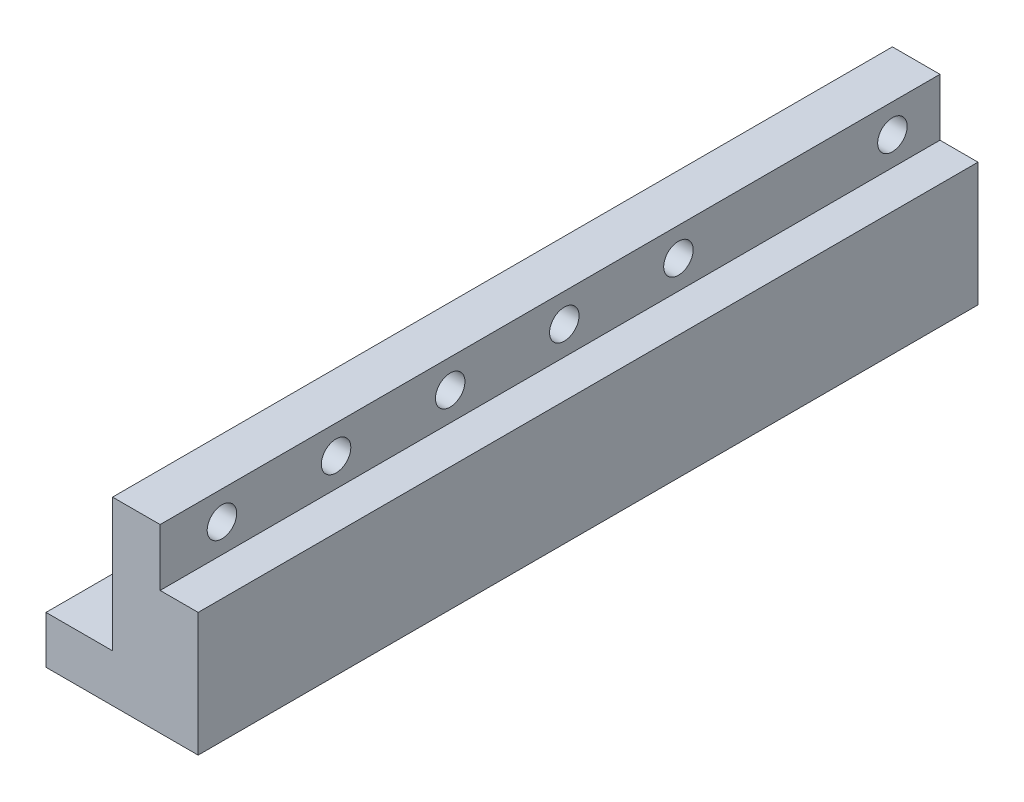
ISO-10303-21;
HEADER;
FILE_DESCRIPTION(('STEP AP214'),'2;1');
FILE_NAME('part.step','',(''),(''),'','','');
FILE_SCHEMA(('AUTOMOTIVE_DESIGN { 1 0 10303 214 1 1 1 1 }'));
ENDSEC;
DATA;
#1=APPLICATION_CONTEXT('core data for automotive mechanical design processes');
#2=APPLICATION_PROTOCOL_DEFINITION('international standard','automotive_design',2000,#1);
#3=PRODUCT_CONTEXT('',#1,'mechanical');
#4=PRODUCT('Part','Part','',(#3));
#5=PRODUCT_RELATED_PRODUCT_CATEGORY('part','',(#4));
#6=PRODUCT_DEFINITION_FORMATION('','',#4);
#7=PRODUCT_DEFINITION_CONTEXT('part definition',#1,'design');
#8=PRODUCT_DEFINITION('design','',#6,#7);
#9=PRODUCT_DEFINITION_SHAPE('','',#8);
#10=(LENGTH_UNIT() NAMED_UNIT(*) SI_UNIT(.MILLI.,.METRE.));
#11=(NAMED_UNIT(*) PLANE_ANGLE_UNIT() SI_UNIT($,.RADIAN.));
#12=(NAMED_UNIT(*) SI_UNIT($,.STERADIAN.) SOLID_ANGLE_UNIT());
#13=UNCERTAINTY_MEASURE_WITH_UNIT(LENGTH_MEASURE(1.E-05),#10,'distance_accuracy_value','');
#14=(GEOMETRIC_REPRESENTATION_CONTEXT(3) GLOBAL_UNCERTAINTY_ASSIGNED_CONTEXT((#13)) GLOBAL_UNIT_ASSIGNED_CONTEXT((#10,
#11,#12)) REPRESENTATION_CONTEXT('',''));
#15=CARTESIAN_POINT('',(0.,0.,0.));
#16=DIRECTION('',(0.,0.,1.));
#17=DIRECTION('',(1.,0.,0.));
#18=AXIS2_PLACEMENT_3D('',#15,#16,#17);
#19=CARTESIAN_POINT('',(-12.5,-13.,71.));
#20=DIRECTION('',(0.,1.,0.));
#21=DIRECTION('',(-1.,0.,0.));
#22=AXIS2_PLACEMENT_3D('',#19,#20,#21);
#23=CYLINDRICAL_SURFACE('',#22,1.55);
#24=CARTESIAN_POINT('',(-12.5,-13.,71.));
#25=DIRECTION('',(0.,1.,0.));
#26=DIRECTION('',(-1.,0.,0.));
#27=AXIS2_PLACEMENT_3D('',#24,#25,#26);
#28=CIRCLE('',#27,1.55);
#29=CARTESIAN_POINT('',(-14.05,-13.,71.));
#30=VERTEX_POINT('',#29);
#31=EDGE_CURVE('E44',#30,#30,#28,.T.);
#32=ORIENTED_EDGE('',*,*,#31,.F.);
#33=EDGE_LOOP('',(#32));
#34=FACE_BOUND('',#33,.T.);
#35=CARTESIAN_POINT('',(-12.5,-8.,71.));
#36=DIRECTION('',(0.,1.,0.));
#37=DIRECTION('',(-1.,0.,0.));
#38=AXIS2_PLACEMENT_3D('',#35,#36,#37);
#39=CIRCLE('',#38,1.55);
#40=CARTESIAN_POINT('',(-14.05,-8.,71.));
#41=VERTEX_POINT('',#40);
#42=EDGE_CURVE('E11',#41,#41,#39,.T.);
#43=ORIENTED_EDGE('',*,*,#42,.T.);
#44=EDGE_LOOP('',(#43));
#45=FACE_BOUND('',#44,.T.);
#46=ADVANCED_FACE('F36',(#34,#45),#23,.F.);
#47=CARTESIAN_POINT('',(-12.5,-13.,56.));
#48=DIRECTION('',(0.,1.,0.));
#49=DIRECTION('',(-1.,0.,0.));
#50=AXIS2_PLACEMENT_3D('',#47,#48,#49);
#51=CYLINDRICAL_SURFACE('',#50,1.55);
#52=CARTESIAN_POINT('',(-12.5,-13.,56.));
#53=DIRECTION('',(0.,1.,0.));
#54=DIRECTION('',(-1.,0.,0.));
#55=AXIS2_PLACEMENT_3D('',#52,#53,#54);
#56=CIRCLE('',#55,1.55);
#57=CARTESIAN_POINT('',(-14.05,-13.,56.));
#58=VERTEX_POINT('',#57);
#59=EDGE_CURVE('E169',#58,#58,#56,.T.);
#60=ORIENTED_EDGE('',*,*,#59,.F.);
#61=EDGE_LOOP('',(#60));
#62=FACE_BOUND('',#61,.T.);
#63=CARTESIAN_POINT('',(-12.5,-8.,56.));
#64=DIRECTION('',(0.,1.,0.));
#65=DIRECTION('',(-1.,0.,0.));
#66=AXIS2_PLACEMENT_3D('',#63,#64,#65);
#67=CIRCLE('',#66,1.55);
#68=CARTESIAN_POINT('',(-14.05,-8.,56.));
#69=VERTEX_POINT('',#68);
#70=EDGE_CURVE('E172',#69,#69,#67,.T.);
#71=ORIENTED_EDGE('',*,*,#70,.T.);
#72=EDGE_LOOP('',(#71));
#73=FACE_BOUND('',#72,.T.);
#74=ADVANCED_FACE('F181',(#62,#73),#51,.F.);
#75=CARTESIAN_POINT('',(-12.5,-13.,41.));
#76=DIRECTION('',(0.,1.,0.));
#77=DIRECTION('',(-1.,0.,0.));
#78=AXIS2_PLACEMENT_3D('',#75,#76,#77);
#79=CYLINDRICAL_SURFACE('',#78,1.55);
#80=CARTESIAN_POINT('',(-12.5,-13.,41.));
#81=DIRECTION('',(0.,1.,0.));
#82=DIRECTION('',(-1.,0.,0.));
#83=AXIS2_PLACEMENT_3D('',#80,#81,#82);
#84=CIRCLE('',#83,1.55);
#85=CARTESIAN_POINT('',(-14.05,-13.,41.));
#86=VERTEX_POINT('',#85);
#87=EDGE_CURVE('E163',#86,#86,#84,.T.);
#88=ORIENTED_EDGE('',*,*,#87,.F.);
#89=EDGE_LOOP('',(#88));
#90=FACE_BOUND('',#89,.T.);
#91=CARTESIAN_POINT('',(-12.5,-8.,41.));
#92=DIRECTION('',(0.,1.,0.));
#93=DIRECTION('',(-1.,0.,0.));
#94=AXIS2_PLACEMENT_3D('',#91,#92,#93);
#95=CIRCLE('',#94,1.55);
#96=CARTESIAN_POINT('',(-14.05,-8.,41.));
#97=VERTEX_POINT('',#96);
#98=EDGE_CURVE('E166',#97,#97,#95,.T.);
#99=ORIENTED_EDGE('',*,*,#98,.T.);
#100=EDGE_LOOP('',(#99));
#101=FACE_BOUND('',#100,.T.);
#102=ADVANCED_FACE('F205',(#90,#101),#79,.F.);
#103=CARTESIAN_POINT('',(-4.,6.,82.));
#104=DIRECTION('',(0.,-1.,0.));
#105=DIRECTION('',(1.,0.,0.));
#106=AXIS2_PLACEMENT_3D('',#103,#104,#105);
#107=PLANE('',#106);
#108=DIRECTION('',(-1.,0.,0.));
#109=VECTOR('',#108,1.);
#110=CARTESIAN_POINT('',(-4.,6.,0.));
#111=LINE('',#110,#109);
#112=CARTESIAN_POINT('',(-4.,6.,0.));
#113=VERTEX_POINT('',#112);
#114=CARTESIAN_POINT('',(-9.,6.,0.));
#115=VERTEX_POINT('',#114);
#116=EDGE_CURVE('E133',#113,#115,#111,.T.);
#117=ORIENTED_EDGE('',*,*,#116,.T.);
#118=DIRECTION('',(0.,0.,-1.));
#119=VECTOR('',#118,1.);
#120=CARTESIAN_POINT('',(-9.,6.,82.));
#121=LINE('',#120,#119);
#122=CARTESIAN_POINT('',(-9.,6.,82.));
#123=VERTEX_POINT('',#122);
#124=EDGE_CURVE('E161',#123,#115,#121,.T.);
#125=ORIENTED_EDGE('',*,*,#124,.F.);
#126=DIRECTION('',(-1.,0.,0.));
#127=VECTOR('',#126,1.);
#128=CARTESIAN_POINT('',(-4.,6.,82.));
#129=LINE('',#128,#127);
#130=CARTESIAN_POINT('',(-4.,6.,82.));
#131=VERTEX_POINT('',#130);
#132=EDGE_CURVE('E148',#131,#123,#129,.T.);
#133=ORIENTED_EDGE('',*,*,#132,.F.);
#134=DIRECTION('',(0.,0.,-1.));
#135=VECTOR('',#134,1.);
#136=CARTESIAN_POINT('',(-4.,6.,82.));
#137=LINE('',#136,#135);
#138=EDGE_CURVE('E129',#131,#113,#137,.T.);
#139=ORIENTED_EDGE('',*,*,#138,.T.);
#140=EDGE_LOOP('',(#117,#125,#133,#139));
#141=FACE_BOUND('',#140,.T.);
#142=ADVANCED_FACE('F196',(#141),#107,.F.);
#143=CARTESIAN_POINT('',(-9.,6.,82.));
#144=DIRECTION('',(1.,0.,0.));
#145=DIRECTION('',(0.,1.,0.));
#146=AXIS2_PLACEMENT_3D('',#143,#144,#145);
#147=PLANE('',#146);
#148=CARTESIAN_POINT('',(-9.,3.,75.5));
#149=DIRECTION('',(1.,0.,0.));
#150=DIRECTION('',(0.,1.,0.));
#151=AXIS2_PLACEMENT_3D('',#148,#149,#150);
#152=CIRCLE('',#151,1.54999999999999);
#153=CARTESIAN_POINT('',(-9.,4.54999999999999,75.5));
#154=VERTEX_POINT('',#153);
#155=EDGE_CURVE('E137',#154,#154,#152,.T.);
#156=ORIENTED_EDGE('',*,*,#155,.T.);
#157=EDGE_LOOP('',(#156));
#158=FACE_BOUND('',#157,.T.);
#159=CARTESIAN_POINT('',(-9.,3.,63.5));
#160=DIRECTION('',(1.,0.,0.));
#161=DIRECTION('',(0.,1.,0.));
#162=AXIS2_PLACEMENT_3D('',#159,#160,#161);
#163=CIRCLE('',#162,1.54999999999999);
#164=CARTESIAN_POINT('',(-9.,4.54999999999999,63.5));
#165=VERTEX_POINT('',#164);
#166=EDGE_CURVE('E316',#165,#165,#163,.T.);
#167=ORIENTED_EDGE('',*,*,#166,.T.);
#168=EDGE_LOOP('',(#167));
#169=FACE_BOUND('',#168,.T.);
#170=CARTESIAN_POINT('',(-9.,3.,51.5));
#171=DIRECTION('',(1.,0.,0.));
#172=DIRECTION('',(0.,1.,0.));
#173=AXIS2_PLACEMENT_3D('',#170,#171,#172);
#174=CIRCLE('',#173,1.55);
#175=CARTESIAN_POINT('',(-9.,4.55,51.5));
#176=VERTEX_POINT('',#175);
#177=EDGE_CURVE('E313',#176,#176,#174,.T.);
#178=ORIENTED_EDGE('',*,*,#177,.T.);
#179=EDGE_LOOP('',(#178));
#180=FACE_BOUND('',#179,.T.);
#181=CARTESIAN_POINT('',(-9.,3.,39.5));
#182=DIRECTION('',(1.,0.,0.));
#183=DIRECTION('',(0.,1.,0.));
#184=AXIS2_PLACEMENT_3D('',#181,#182,#183);
#185=CIRCLE('',#184,1.55);
#186=CARTESIAN_POINT('',(-9.,4.55,39.5));
#187=VERTEX_POINT('',#186);
#188=EDGE_CURVE('E310',#187,#187,#185,.T.);
#189=ORIENTED_EDGE('',*,*,#188,.T.);
#190=EDGE_LOOP('',(#189));
#191=FACE_BOUND('',#190,.T.);
#192=CARTESIAN_POINT('',(-9.,3.,27.5));
#193=DIRECTION('',(1.,0.,0.));
#194=DIRECTION('',(0.,1.,0.));
#195=AXIS2_PLACEMENT_3D('',#192,#193,#194);
#196=CIRCLE('',#195,1.55);
#197=CARTESIAN_POINT('',(-9.,4.55,27.5));
#198=VERTEX_POINT('',#197);
#199=EDGE_CURVE('E307',#198,#198,#196,.T.);
#200=ORIENTED_EDGE('',*,*,#199,.T.);
#201=EDGE_LOOP('',(#200));
#202=FACE_BOUND('',#201,.T.);
#203=CARTESIAN_POINT('',(-9.,3.,5.));
#204=DIRECTION('',(1.,0.,0.));
#205=DIRECTION('',(0.,1.,0.));
#206=AXIS2_PLACEMENT_3D('',#203,#204,#205);
#207=CIRCLE('',#206,1.55);
#208=CARTESIAN_POINT('',(-9.,4.55,5.));
#209=VERTEX_POINT('',#208);
#210=EDGE_CURVE('E290',#209,#209,#207,.T.);
#211=ORIENTED_EDGE('',*,*,#210,.T.);
#212=EDGE_LOOP('',(#211));
#213=FACE_BOUND('',#212,.T.);
#214=DIRECTION('',(0.,-1.,0.));
#215=VECTOR('',#214,1.);
#216=CARTESIAN_POINT('',(-9.,6.,0.));
#217=LINE('',#216,#215);
#218=CARTESIAN_POINT('',(-9.,-8.,0.));
#219=VERTEX_POINT('',#218);
#220=EDGE_CURVE('E136',#115,#219,#217,.T.);
#221=ORIENTED_EDGE('',*,*,#220,.T.);
#222=DIRECTION('',(0.,0.,-1.));
#223=VECTOR('',#222,1.);
#224=CARTESIAN_POINT('',(-9.,-8.,82.));
#225=LINE('',#224,#223);
#226=CARTESIAN_POINT('',(-9.,-8.,82.));
#227=VERTEX_POINT('',#226);
#228=EDGE_CURVE('E158',#227,#219,#225,.T.);
#229=ORIENTED_EDGE('',*,*,#228,.F.);
#230=DIRECTION('',(0.,-1.,0.));
#231=VECTOR('',#230,1.);
#232=CARTESIAN_POINT('',(-9.,6.,82.));
#233=LINE('',#232,#231);
#234=EDGE_CURVE('E96',#123,#227,#233,.T.);
#235=ORIENTED_EDGE('',*,*,#234,.F.);
#236=ORIENTED_EDGE('',*,*,#124,.T.);
#237=EDGE_LOOP('',(#221,#229,#235,#236));
#238=FACE_BOUND('',#237,.T.);
#239=ADVANCED_FACE('F187',(#158,#169,#180,#191,#202,#213,#238),#147,.F.);
#240=CARTESIAN_POINT('',(-9.,-8.,82.));
#241=DIRECTION('',(0.,-1.,0.));
#242=DIRECTION('',(0.,0.,-1.));
#243=AXIS2_PLACEMENT_3D('',#240,#241,#242);
#244=PLANE('',#243);
#245=CARTESIAN_POINT('',(-12.5,-8.,26.));
#246=DIRECTION('',(0.,1.,0.));
#247=DIRECTION('',(-1.,0.,0.));
#248=AXIS2_PLACEMENT_3D('',#245,#246,#247);
#249=CIRCLE('',#248,1.55);
#250=CARTESIAN_POINT('',(-14.05,-8.,26.));
#251=VERTEX_POINT('',#250);
#252=EDGE_CURVE('E276',#251,#251,#249,.T.);
#253=ORIENTED_EDGE('',*,*,#252,.F.);
#254=EDGE_LOOP('',(#253));
#255=FACE_BOUND('',#254,.T.);
#256=CARTESIAN_POINT('',(-12.5,-8.,11.));
#257=DIRECTION('',(0.,1.,0.));
#258=DIRECTION('',(-1.,0.,0.));
#259=AXIS2_PLACEMENT_3D('',#256,#257,#258);
#260=CIRCLE('',#259,1.55);
#261=CARTESIAN_POINT('',(-14.05,-8.,11.));
#262=VERTEX_POINT('',#261);
#263=EDGE_CURVE('E277',#262,#262,#260,.T.);
#264=ORIENTED_EDGE('',*,*,#263,.F.);
#265=EDGE_LOOP('',(#264));
#266=FACE_BOUND('',#265,.T.);
#267=DIRECTION('',(-1.,0.,0.));
#268=VECTOR('',#267,1.);
#269=CARTESIAN_POINT('',(-9.,-8.,0.));
#270=LINE('',#269,#268);
#271=CARTESIAN_POINT('',(-16.,-8.,0.));
#272=VERTEX_POINT('',#271);
#273=EDGE_CURVE('E139',#219,#272,#270,.T.);
#274=ORIENTED_EDGE('',*,*,#273,.T.);
#275=DIRECTION('',(0.,0.,-1.));
#276=VECTOR('',#275,1.);
#277=CARTESIAN_POINT('',(-16.,-8.,82.));
#278=LINE('',#277,#276);
#279=CARTESIAN_POINT('',(-16.,-8.,82.));
#280=VERTEX_POINT('',#279);
#281=EDGE_CURVE('E155',#280,#272,#278,.T.);
#282=ORIENTED_EDGE('',*,*,#281,.F.);
#283=DIRECTION('',(-1.,0.,0.));
#284=VECTOR('',#283,1.);
#285=CARTESIAN_POINT('',(-9.,-8.,82.));
#286=LINE('',#285,#284);
#287=EDGE_CURVE('E323',#227,#280,#286,.T.);
#288=ORIENTED_EDGE('',*,*,#287,.F.);
#289=ORIENTED_EDGE('',*,*,#228,.T.);
#290=EDGE_LOOP('',(#274,#282,#288,#289));
#291=FACE_BOUND('',#290,.T.);
#292=ORIENTED_EDGE('',*,*,#98,.F.);
#293=EDGE_LOOP('',(#292));
#294=FACE_BOUND('',#293,.T.);
#295=ORIENTED_EDGE('',*,*,#70,.F.);
#296=EDGE_LOOP('',(#295));
#297=FACE_BOUND('',#296,.T.);
#298=ORIENTED_EDGE('',*,*,#42,.F.);
#299=EDGE_LOOP('',(#298));
#300=FACE_BOUND('',#299,.T.);
#301=ADVANCED_FACE('F184',(#255,#266,#291,#294,#297,#300),#244,.F.);
#302=CARTESIAN_POINT('',(-16.,-8.,82.));
#303=DIRECTION('',(1.,0.,0.));
#304=DIRECTION('',(0.,0.,-1.));
#305=AXIS2_PLACEMENT_3D('',#302,#303,#304);
#306=PLANE('',#305);
#307=DIRECTION('',(0.,-1.,0.));
#308=VECTOR('',#307,1.);
#309=CARTESIAN_POINT('',(-16.,-8.,0.));
#310=LINE('',#309,#308);
#311=CARTESIAN_POINT('',(-16.,-13.,0.));
#312=VERTEX_POINT('',#311);
#313=EDGE_CURVE('E141',#272,#312,#310,.T.);
#314=ORIENTED_EDGE('',*,*,#313,.T.);
#315=DIRECTION('',(0.,0.,-1.));
#316=VECTOR('',#315,1.);
#317=CARTESIAN_POINT('',(-16.,-13.,82.));
#318=LINE('',#317,#316);
#319=CARTESIAN_POINT('',(-16.,-13.,82.));
#320=VERTEX_POINT('',#319);
#321=EDGE_CURVE('E152',#320,#312,#318,.T.);
#322=ORIENTED_EDGE('',*,*,#321,.F.);
#323=DIRECTION('',(0.,-1.,0.));
#324=VECTOR('',#323,1.);
#325=CARTESIAN_POINT('',(-16.,-8.,82.));
#326=LINE('',#325,#324);
#327=EDGE_CURVE('E325',#280,#320,#326,.T.);
#328=ORIENTED_EDGE('',*,*,#327,.F.);
#329=ORIENTED_EDGE('',*,*,#281,.T.);
#330=EDGE_LOOP('',(#314,#322,#328,#329));
#331=FACE_BOUND('',#330,.T.);
#332=ADVANCED_FACE('F186',(#331),#306,.F.);
#333=CARTESIAN_POINT('',(-16.,-13.,82.));
#334=DIRECTION('',(0.,1.,0.));
#335=DIRECTION('',(0.,0.,1.));
#336=AXIS2_PLACEMENT_3D('',#333,#334,#335);
#337=PLANE('',#336);
#338=CARTESIAN_POINT('',(-12.5,-13.,26.));
#339=DIRECTION('',(0.,1.,0.));
#340=DIRECTION('',(-1.,0.,0.));
#341=AXIS2_PLACEMENT_3D('',#338,#339,#340);
#342=CIRCLE('',#341,1.55);
#343=CARTESIAN_POINT('',(-14.05,-13.,26.));
#344=VERTEX_POINT('',#343);
#345=EDGE_CURVE('E274',#344,#344,#342,.T.);
#346=ORIENTED_EDGE('',*,*,#345,.T.);
#347=EDGE_LOOP('',(#346));
#348=FACE_BOUND('',#347,.T.);
#349=CARTESIAN_POINT('',(-12.5,-13.,11.));
#350=DIRECTION('',(0.,1.,0.));
#351=DIRECTION('',(-1.,0.,0.));
#352=AXIS2_PLACEMENT_3D('',#349,#350,#351);
#353=CIRCLE('',#352,1.55);
#354=CARTESIAN_POINT('',(-14.05,-13.,11.));
#355=VERTEX_POINT('',#354);
#356=EDGE_CURVE('E280',#355,#355,#353,.T.);
#357=ORIENTED_EDGE('',*,*,#356,.T.);
#358=EDGE_LOOP('',(#357));
#359=FACE_BOUND('',#358,.T.);
#360=DIRECTION('',(1.,0.,0.));
#361=VECTOR('',#360,1.);
#362=CARTESIAN_POINT('',(-16.,-13.,0.));
#363=LINE('',#362,#361);
#364=CARTESIAN_POINT('',(0.,-13.,0.));
#365=VERTEX_POINT('',#364);
#366=EDGE_CURVE('E143',#312,#365,#363,.T.);
#367=ORIENTED_EDGE('',*,*,#366,.T.);
#368=DIRECTION('',(0.,0.,-1.));
#369=VECTOR('',#368,1.);
#370=CARTESIAN_POINT('',(0.,-13.,82.));
#371=LINE('',#370,#369);
#372=CARTESIAN_POINT('',(0.,-13.,82.));
#373=VERTEX_POINT('',#372);
#374=EDGE_CURVE('E124',#373,#365,#371,.T.);
#375=ORIENTED_EDGE('',*,*,#374,.F.);
#376=DIRECTION('',(1.,0.,0.));
#377=VECTOR('',#376,1.);
#378=CARTESIAN_POINT('',(-16.,-13.,82.));
#379=LINE('',#378,#377);
#380=EDGE_CURVE('E115',#320,#373,#379,.T.);
#381=ORIENTED_EDGE('',*,*,#380,.F.);
#382=ORIENTED_EDGE('',*,*,#321,.T.);
#383=EDGE_LOOP('',(#367,#375,#381,#382));
#384=FACE_BOUND('',#383,.T.);
#385=ORIENTED_EDGE('',*,*,#87,.T.);
#386=EDGE_LOOP('',(#385));
#387=FACE_BOUND('',#386,.T.);
#388=ORIENTED_EDGE('',*,*,#59,.T.);
#389=EDGE_LOOP('',(#388));
#390=FACE_BOUND('',#389,.T.);
#391=ORIENTED_EDGE('',*,*,#31,.T.);
#392=EDGE_LOOP('',(#391));
#393=FACE_BOUND('',#392,.T.);
#394=ADVANCED_FACE('F177',(#348,#359,#384,#387,#390,#393),#337,.F.);
#395=CARTESIAN_POINT('',(0.,-13.,82.));
#396=DIRECTION('',(-1.,0.,0.));
#397=DIRECTION('',(0.,0.,1.));
#398=AXIS2_PLACEMENT_3D('',#395,#396,#397);
#399=PLANE('',#398);
#400=DIRECTION('',(0.,1.,0.));
#401=VECTOR('',#400,1.);
#402=CARTESIAN_POINT('',(0.,-13.,0.));
#403=LINE('',#402,#401);
#404=CARTESIAN_POINT('',(0.,0.,0.));
#405=VERTEX_POINT('',#404);
#406=EDGE_CURVE('E123',#365,#405,#403,.T.);
#407=ORIENTED_EDGE('',*,*,#406,.T.);
#408=DIRECTION('',(0.,0.,-1.));
#409=VECTOR('',#408,1.);
#410=CARTESIAN_POINT('',(0.,0.,82.));
#411=LINE('',#410,#409);
#412=CARTESIAN_POINT('',(0.,0.,82.));
#413=VERTEX_POINT('',#412);
#414=EDGE_CURVE('E120',#413,#405,#411,.T.);
#415=ORIENTED_EDGE('',*,*,#414,.F.);
#416=DIRECTION('',(0.,1.,0.));
#417=VECTOR('',#416,1.);
#418=CARTESIAN_POINT('',(0.,-13.,82.));
#419=LINE('',#418,#417);
#420=EDGE_CURVE('E109',#373,#413,#419,.T.);
#421=ORIENTED_EDGE('',*,*,#420,.F.);
#422=ORIENTED_EDGE('',*,*,#374,.T.);
#423=EDGE_LOOP('',(#407,#415,#421,#422));
#424=FACE_BOUND('',#423,.T.);
#425=ADVANCED_FACE('F121',(#424),#399,.F.);
#426=CARTESIAN_POINT('',(0.,0.,82.));
#427=DIRECTION('',(0.,-1.,0.));
#428=DIRECTION('',(1.,0.,0.));
#429=AXIS2_PLACEMENT_3D('',#426,#427,#428);
#430=PLANE('',#429);
#431=DIRECTION('',(-1.,0.,0.));
#432=VECTOR('',#431,1.);
#433=CARTESIAN_POINT('',(0.,0.,0.));
#434=LINE('',#433,#432);
#435=CARTESIAN_POINT('',(-4.,0.,0.));
#436=VERTEX_POINT('',#435);
#437=EDGE_CURVE('E81',#405,#436,#434,.T.);
#438=ORIENTED_EDGE('',*,*,#437,.T.);
#439=DIRECTION('',(0.,0.,-1.));
#440=VECTOR('',#439,1.);
#441=CARTESIAN_POINT('',(-4.,0.,82.));
#442=LINE('',#441,#440);
#443=CARTESIAN_POINT('',(-4.,0.,82.));
#444=VERTEX_POINT('',#443);
#445=EDGE_CURVE('E125',#444,#436,#442,.T.);
#446=ORIENTED_EDGE('',*,*,#445,.F.);
#447=DIRECTION('',(-1.,0.,0.));
#448=VECTOR('',#447,1.);
#449=CARTESIAN_POINT('',(0.,0.,82.));
#450=LINE('',#449,#448);
#451=EDGE_CURVE('E113',#413,#444,#450,.T.);
#452=ORIENTED_EDGE('',*,*,#451,.F.);
#453=ORIENTED_EDGE('',*,*,#414,.T.);
#454=EDGE_LOOP('',(#438,#446,#452,#453));
#455=FACE_BOUND('',#454,.T.);
#456=ADVANCED_FACE('F127',(#455),#430,.F.);
#457=CARTESIAN_POINT('',(-4.,0.,82.));
#458=DIRECTION('',(-1.,0.,0.));
#459=DIRECTION('',(0.,0.,1.));
#460=AXIS2_PLACEMENT_3D('',#457,#458,#459);
#461=PLANE('',#460);
#462=CARTESIAN_POINT('',(-4.,3.,75.5));
#463=DIRECTION('',(1.,0.,0.));
#464=DIRECTION('',(0.,0.,-1.));
#465=AXIS2_PLACEMENT_3D('',#462,#463,#464);
#466=CIRCLE('',#465,1.54999999999999);
#467=CARTESIAN_POINT('',(-4.,3.,73.95));
#468=VERTEX_POINT('',#467);
#469=EDGE_CURVE('E287',#468,#468,#466,.T.);
#470=ORIENTED_EDGE('',*,*,#469,.F.);
#471=EDGE_LOOP('',(#470));
#472=FACE_BOUND('',#471,.T.);
#473=CARTESIAN_POINT('',(-4.,3.,63.5));
#474=DIRECTION('',(1.,0.,0.));
#475=DIRECTION('',(0.,0.,-1.));
#476=AXIS2_PLACEMENT_3D('',#473,#474,#475);
#477=CIRCLE('',#476,1.54999999999999);
#478=CARTESIAN_POINT('',(-4.,3.,61.95));
#479=VERTEX_POINT('',#478);
#480=EDGE_CURVE('E291',#479,#479,#477,.T.);
#481=ORIENTED_EDGE('',*,*,#480,.F.);
#482=EDGE_LOOP('',(#481));
#483=FACE_BOUND('',#482,.T.);
#484=CARTESIAN_POINT('',(-4.,3.,51.5));
#485=DIRECTION('',(1.,0.,0.));
#486=DIRECTION('',(0.,0.,-1.));
#487=AXIS2_PLACEMENT_3D('',#484,#485,#486);
#488=CIRCLE('',#487,1.55);
#489=CARTESIAN_POINT('',(-4.,3.,49.95));
#490=VERTEX_POINT('',#489);
#491=EDGE_CURVE('E294',#490,#490,#488,.T.);
#492=ORIENTED_EDGE('',*,*,#491,.F.);
#493=EDGE_LOOP('',(#492));
#494=FACE_BOUND('',#493,.T.);
#495=CARTESIAN_POINT('',(-4.,3.,39.5));
#496=DIRECTION('',(1.,0.,0.));
#497=DIRECTION('',(0.,0.,-1.));
#498=AXIS2_PLACEMENT_3D('',#495,#496,#497);
#499=CIRCLE('',#498,1.55);
#500=CARTESIAN_POINT('',(-4.,3.,37.95));
#501=VERTEX_POINT('',#500);
#502=EDGE_CURVE('E297',#501,#501,#499,.T.);
#503=ORIENTED_EDGE('',*,*,#502,.F.);
#504=EDGE_LOOP('',(#503));
#505=FACE_BOUND('',#504,.T.);
#506=CARTESIAN_POINT('',(-4.,3.,27.5));
#507=DIRECTION('',(1.,0.,0.));
#508=DIRECTION('',(0.,0.,-1.));
#509=AXIS2_PLACEMENT_3D('',#506,#507,#508);
#510=CIRCLE('',#509,1.55);
#511=CARTESIAN_POINT('',(-4.,3.,25.95));
#512=VERTEX_POINT('',#511);
#513=EDGE_CURVE('E300',#512,#512,#510,.T.);
#514=ORIENTED_EDGE('',*,*,#513,.F.);
#515=EDGE_LOOP('',(#514));
#516=FACE_BOUND('',#515,.T.);
#517=CARTESIAN_POINT('',(-4.,3.,5.));
#518=DIRECTION('',(1.,0.,0.));
#519=DIRECTION('',(0.,0.,-1.));
#520=AXIS2_PLACEMENT_3D('',#517,#518,#519);
#521=CIRCLE('',#520,1.55);
#522=CARTESIAN_POINT('',(-4.,3.,3.45));
#523=VERTEX_POINT('',#522);
#524=EDGE_CURVE('E285',#523,#523,#521,.T.);
#525=ORIENTED_EDGE('',*,*,#524,.F.);
#526=EDGE_LOOP('',(#525));
#527=FACE_BOUND('',#526,.T.);
#528=DIRECTION('',(0.,1.,0.));
#529=VECTOR('',#528,1.);
#530=CARTESIAN_POINT('',(-4.,0.,0.));
#531=LINE('',#530,#529);
#532=EDGE_CURVE('E87',#436,#113,#531,.T.);
#533=ORIENTED_EDGE('',*,*,#532,.T.);
#534=ORIENTED_EDGE('',*,*,#138,.F.);
#535=DIRECTION('',(0.,1.,0.));
#536=VECTOR('',#535,1.);
#537=CARTESIAN_POINT('',(-4.,0.,82.));
#538=LINE('',#537,#536);
#539=EDGE_CURVE('E52',#444,#131,#538,.T.);
#540=ORIENTED_EDGE('',*,*,#539,.F.);
#541=ORIENTED_EDGE('',*,*,#445,.T.);
#542=EDGE_LOOP('',(#533,#534,#540,#541));
#543=FACE_BOUND('',#542,.T.);
#544=ADVANCED_FACE('F229',(#472,#483,#494,#505,#516,#527,#543),#461,.F.);
#545=CARTESIAN_POINT('',(0.,0.,82.));
#546=DIRECTION('',(0.,0.,1.));
#547=DIRECTION('',(1.,0.,0.));
#548=AXIS2_PLACEMENT_3D('',#545,#546,#547);
#549=PLANE('',#548);
#550=ORIENTED_EDGE('',*,*,#132,.T.);
#551=ORIENTED_EDGE('',*,*,#234,.T.);
#552=ORIENTED_EDGE('',*,*,#287,.T.);
#553=ORIENTED_EDGE('',*,*,#327,.T.);
#554=ORIENTED_EDGE('',*,*,#380,.T.);
#555=ORIENTED_EDGE('',*,*,#420,.T.);
#556=ORIENTED_EDGE('',*,*,#451,.T.);
#557=ORIENTED_EDGE('',*,*,#539,.T.);
#558=EDGE_LOOP('',(#550,#551,#552,#553,#554,#555,#556,#557));
#559=FACE_BOUND('',#558,.T.);
#560=ADVANCED_FACE('F111',(#559),#549,.T.);
#561=CARTESIAN_POINT('',(0.,0.,0.));
#562=DIRECTION('',(0.,0.,1.));
#563=DIRECTION('',(1.,0.,0.));
#564=AXIS2_PLACEMENT_3D('',#561,#562,#563);
#565=PLANE('',#564);
#566=ORIENTED_EDGE('',*,*,#116,.F.);
#567=ORIENTED_EDGE('',*,*,#532,.F.);
#568=ORIENTED_EDGE('',*,*,#437,.F.);
#569=ORIENTED_EDGE('',*,*,#406,.F.);
#570=ORIENTED_EDGE('',*,*,#366,.F.);
#571=ORIENTED_EDGE('',*,*,#313,.F.);
#572=ORIENTED_EDGE('',*,*,#273,.F.);
#573=ORIENTED_EDGE('',*,*,#220,.F.);
#574=EDGE_LOOP('',(#566,#567,#568,#569,#570,#571,#572,#573));
#575=FACE_BOUND('',#574,.T.);
#576=ADVANCED_FACE('F233',(#575),#565,.F.);
#577=CARTESIAN_POINT('',(-16.,3.,5.));
#578=DIRECTION('',(1.,0.,0.));
#579=DIRECTION('',(0.,0.,-1.));
#580=AXIS2_PLACEMENT_3D('',#577,#578,#579);
#581=CYLINDRICAL_SURFACE('',#580,1.55);
#582=ORIENTED_EDGE('',*,*,#524,.T.);
#583=EDGE_LOOP('',(#582));
#584=FACE_BOUND('',#583,.T.);
#585=ORIENTED_EDGE('',*,*,#210,.F.);
#586=EDGE_LOOP('',(#585));
#587=FACE_BOUND('',#586,.T.);
#588=ADVANCED_FACE('F236',(#584,#587),#581,.F.);
#589=CARTESIAN_POINT('',(-16.,3.,27.5));
#590=DIRECTION('',(1.,0.,0.));
#591=DIRECTION('',(0.,0.,-1.));
#592=AXIS2_PLACEMENT_3D('',#589,#590,#591);
#593=CYLINDRICAL_SURFACE('',#592,1.55);
#594=ORIENTED_EDGE('',*,*,#513,.T.);
#595=EDGE_LOOP('',(#594));
#596=FACE_BOUND('',#595,.T.);
#597=ORIENTED_EDGE('',*,*,#199,.F.);
#598=EDGE_LOOP('',(#597));
#599=FACE_BOUND('',#598,.T.);
#600=ADVANCED_FACE('F242',(#596,#599),#593,.F.);
#601=CARTESIAN_POINT('',(-16.,3.,39.5));
#602=DIRECTION('',(1.,0.,0.));
#603=DIRECTION('',(0.,0.,-1.));
#604=AXIS2_PLACEMENT_3D('',#601,#602,#603);
#605=CYLINDRICAL_SURFACE('',#604,1.55);
#606=ORIENTED_EDGE('',*,*,#502,.T.);
#607=EDGE_LOOP('',(#606));
#608=FACE_BOUND('',#607,.T.);
#609=ORIENTED_EDGE('',*,*,#188,.F.);
#610=EDGE_LOOP('',(#609));
#611=FACE_BOUND('',#610,.T.);
#612=ADVANCED_FACE('F246',(#608,#611),#605,.F.);
#613=CARTESIAN_POINT('',(-16.,3.,51.5));
#614=DIRECTION('',(1.,0.,0.));
#615=DIRECTION('',(0.,0.,-1.));
#616=AXIS2_PLACEMENT_3D('',#613,#614,#615);
#617=CYLINDRICAL_SURFACE('',#616,1.55);
#618=ORIENTED_EDGE('',*,*,#491,.T.);
#619=EDGE_LOOP('',(#618));
#620=FACE_BOUND('',#619,.T.);
#621=ORIENTED_EDGE('',*,*,#177,.F.);
#622=EDGE_LOOP('',(#621));
#623=FACE_BOUND('',#622,.T.);
#624=ADVANCED_FACE('F250',(#620,#623),#617,.F.);
#625=CARTESIAN_POINT('',(-16.,3.,63.5));
#626=DIRECTION('',(1.,0.,0.));
#627=DIRECTION('',(0.,0.,-1.));
#628=AXIS2_PLACEMENT_3D('',#625,#626,#627);
#629=CYLINDRICAL_SURFACE('',#628,1.54999999999999);
#630=ORIENTED_EDGE('',*,*,#480,.T.);
#631=EDGE_LOOP('',(#630));
#632=FACE_BOUND('',#631,.T.);
#633=ORIENTED_EDGE('',*,*,#166,.F.);
#634=EDGE_LOOP('',(#633));
#635=FACE_BOUND('',#634,.T.);
#636=ADVANCED_FACE('F254',(#632,#635),#629,.F.);
#637=CARTESIAN_POINT('',(-16.,3.,75.5));
#638=DIRECTION('',(1.,0.,0.));
#639=DIRECTION('',(0.,0.,-1.));
#640=AXIS2_PLACEMENT_3D('',#637,#638,#639);
#641=CYLINDRICAL_SURFACE('',#640,1.54999999999999);
#642=ORIENTED_EDGE('',*,*,#469,.T.);
#643=EDGE_LOOP('',(#642));
#644=FACE_BOUND('',#643,.T.);
#645=ORIENTED_EDGE('',*,*,#155,.F.);
#646=EDGE_LOOP('',(#645));
#647=FACE_BOUND('',#646,.T.);
#648=ADVANCED_FACE('F258',(#644,#647),#641,.F.);
#649=CARTESIAN_POINT('',(-12.5,-13.,11.));
#650=DIRECTION('',(0.,1.,0.));
#651=DIRECTION('',(-1.,0.,0.));
#652=AXIS2_PLACEMENT_3D('',#649,#650,#651);
#653=CYLINDRICAL_SURFACE('',#652,1.55);
#654=ORIENTED_EDGE('',*,*,#356,.F.);
#655=EDGE_LOOP('',(#654));
#656=FACE_BOUND('',#655,.T.);
#657=ORIENTED_EDGE('',*,*,#263,.T.);
#658=EDGE_LOOP('',(#657));
#659=FACE_BOUND('',#658,.T.);
#660=ADVANCED_FACE('F262',(#656,#659),#653,.F.);
#661=CARTESIAN_POINT('',(-12.5,-13.,26.));
#662=DIRECTION('',(0.,1.,0.));
#663=DIRECTION('',(-1.,0.,0.));
#664=AXIS2_PLACEMENT_3D('',#661,#662,#663);
#665=CYLINDRICAL_SURFACE('',#664,1.55);
#666=ORIENTED_EDGE('',*,*,#345,.F.);
#667=EDGE_LOOP('',(#666));
#668=FACE_BOUND('',#667,.T.);
#669=ORIENTED_EDGE('',*,*,#252,.T.);
#670=EDGE_LOOP('',(#669));
#671=FACE_BOUND('',#670,.T.);
#672=ADVANCED_FACE('F266',(#668,#671),#665,.F.);
#673=CLOSED_SHELL('',(#46,#74,#102,#142,#239,#301,#332,#394,#425,#456,#544,#560,#576,#588,#600,
#612,#624,#636,#648,#660,#672));
#674=MANIFOLD_SOLID_BREP('B2',#673);
#675=ADVANCED_BREP_SHAPE_REPRESENTATION('',(#18,#674),#14);
#676=SHAPE_DEFINITION_REPRESENTATION(#9,#675);
ENDSEC;
END-ISO-10303-21;
